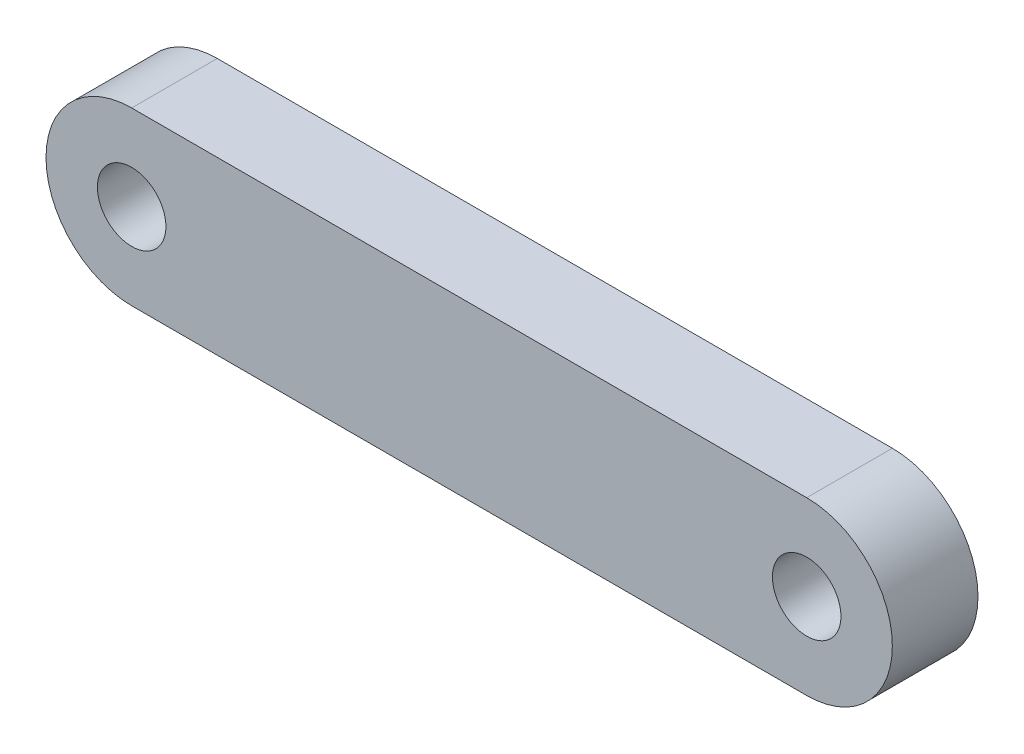
ISO-10303-21;
HEADER;
FILE_DESCRIPTION(('STEP AP214'),'2;1');
FILE_NAME('part.step','',(''),(''),'','','');
FILE_SCHEMA(('AUTOMOTIVE_DESIGN { 1 0 10303 214 1 1 1 1 }'));
ENDSEC;
DATA;
#1=APPLICATION_CONTEXT('core data for automotive mechanical design processes');
#2=APPLICATION_PROTOCOL_DEFINITION('international standard','automotive_design',2000,#1);
#3=PRODUCT_CONTEXT('',#1,'mechanical');
#4=PRODUCT('Part','Part','',(#3));
#5=PRODUCT_RELATED_PRODUCT_CATEGORY('part','',(#4));
#6=PRODUCT_DEFINITION_FORMATION('','',#4);
#7=PRODUCT_DEFINITION_CONTEXT('part definition',#1,'design');
#8=PRODUCT_DEFINITION('design','',#6,#7);
#9=PRODUCT_DEFINITION_SHAPE('','',#8);
#10=(LENGTH_UNIT() NAMED_UNIT(*) SI_UNIT(.MILLI.,.METRE.));
#11=(NAMED_UNIT(*) PLANE_ANGLE_UNIT() SI_UNIT($,.RADIAN.));
#12=(NAMED_UNIT(*) SI_UNIT($,.STERADIAN.) SOLID_ANGLE_UNIT());
#13=UNCERTAINTY_MEASURE_WITH_UNIT(LENGTH_MEASURE(1.E-05),#10,'distance_accuracy_value','');
#14=(GEOMETRIC_REPRESENTATION_CONTEXT(3) GLOBAL_UNCERTAINTY_ASSIGNED_CONTEXT((#13)) GLOBAL_UNIT_ASSIGNED_CONTEXT((#10,
#11,#12)) REPRESENTATION_CONTEXT('',''));
#15=CARTESIAN_POINT('',(0.,0.,0.));
#16=DIRECTION('',(0.,0.,1.));
#17=DIRECTION('',(1.,0.,0.));
#18=AXIS2_PLACEMENT_3D('',#15,#16,#17);
#19=CARTESIAN_POINT('',(-19.7,0.,2.5));
#20=DIRECTION('',(0.,0.,1.));
#21=DIRECTION('',(1.,0.,0.));
#22=AXIS2_PLACEMENT_3D('',#19,#20,#21);
#23=PLANE('',#22);
#24=CARTESIAN_POINT('',(19.7,0.,2.5));
#25=DIRECTION('',(0.,0.,1.));
#26=DIRECTION('',(1.,0.,0.));
#27=AXIS2_PLACEMENT_3D('',#24,#25,#26);
#28=CIRCLE('',#27,2.);
#29=CARTESIAN_POINT('',(21.7,0.,2.5));
#30=VERTEX_POINT('',#29);
#31=EDGE_CURVE('E112',#30,#30,#28,.T.);
#32=ORIENTED_EDGE('',*,*,#31,.F.);
#33=EDGE_LOOP('',(#32));
#34=FACE_BOUND('',#33,.T.);
#35=CARTESIAN_POINT('',(-19.7,0.,2.5));
#36=DIRECTION('',(0.,0.,1.));
#37=DIRECTION('',(1.,0.,0.));
#38=AXIS2_PLACEMENT_3D('',#35,#36,#37);
#39=CIRCLE('',#38,5.);
#40=CARTESIAN_POINT('',(-19.7,5.,2.5));
#41=VERTEX_POINT('',#40);
#42=CARTESIAN_POINT('',(-19.7,-5.,2.5));
#43=VERTEX_POINT('',#42);
#44=EDGE_CURVE('E92',#41,#43,#39,.T.);
#45=ORIENTED_EDGE('',*,*,#44,.T.);
#46=DIRECTION('',(1.,0.,0.));
#47=VECTOR('',#46,1.);
#48=CARTESIAN_POINT('',(-19.7,-5.,2.5));
#49=LINE('',#48,#47);
#50=CARTESIAN_POINT('',(19.7,-4.99999999999999,2.5));
#51=VERTEX_POINT('',#50);
#52=EDGE_CURVE('E87',#43,#51,#49,.T.);
#53=ORIENTED_EDGE('',*,*,#52,.T.);
#54=CARTESIAN_POINT('',(19.7,0.,2.5));
#55=DIRECTION('',(0.,0.,1.));
#56=DIRECTION('',(1.,0.,0.));
#57=AXIS2_PLACEMENT_3D('',#54,#55,#56);
#58=CIRCLE('',#57,5.);
#59=CARTESIAN_POINT('',(19.7,5.00000000000001,2.5));
#60=VERTEX_POINT('',#59);
#61=EDGE_CURVE('E90',#51,#60,#58,.T.);
#62=ORIENTED_EDGE('',*,*,#61,.T.);
#63=DIRECTION('',(-1.,0.,0.));
#64=VECTOR('',#63,1.);
#65=CARTESIAN_POINT('',(-19.7,5.,2.5));
#66=LINE('',#65,#64);
#67=EDGE_CURVE('E57',#60,#41,#66,.T.);
#68=ORIENTED_EDGE('',*,*,#67,.T.);
#69=EDGE_LOOP('',(#45,#53,#62,#68));
#70=FACE_BOUND('',#69,.T.);
#71=CARTESIAN_POINT('',(-19.7,0.,2.5));
#72=DIRECTION('',(0.,0.,1.));
#73=DIRECTION('',(1.,0.,0.));
#74=AXIS2_PLACEMENT_3D('',#71,#72,#73);
#75=CIRCLE('',#74,2.);
#76=CARTESIAN_POINT('',(-17.7,0.,2.5));
#77=VERTEX_POINT('',#76);
#78=EDGE_CURVE('E134',#77,#77,#75,.T.);
#79=ORIENTED_EDGE('',*,*,#78,.F.);
#80=EDGE_LOOP('',(#79));
#81=FACE_BOUND('',#80,.T.);
#82=ADVANCED_FACE('F39',(#34,#70,#81),#23,.T.);
#83=CARTESIAN_POINT('',(-19.7,0.,-2.5));
#84=DIRECTION('',(0.,0.,1.));
#85=DIRECTION('',(1.,0.,0.));
#86=AXIS2_PLACEMENT_3D('',#83,#84,#85);
#87=PLANE('',#86);
#88=CARTESIAN_POINT('',(-19.7,0.,-2.5));
#89=DIRECTION('',(0.,0.,1.));
#90=DIRECTION('',(1.,0.,0.));
#91=AXIS2_PLACEMENT_3D('',#88,#89,#90);
#92=CIRCLE('',#91,5.);
#93=CARTESIAN_POINT('',(-19.7,5.,-2.5));
#94=VERTEX_POINT('',#93);
#95=CARTESIAN_POINT('',(-19.7,-5.,-2.5));
#96=VERTEX_POINT('',#95);
#97=EDGE_CURVE('E108',#94,#96,#92,.T.);
#98=ORIENTED_EDGE('',*,*,#97,.F.);
#99=DIRECTION('',(-1.,0.,0.));
#100=VECTOR('',#99,1.);
#101=CARTESIAN_POINT('',(-19.7,5.,-2.5));
#102=LINE('',#101,#100);
#103=CARTESIAN_POINT('',(19.7,5.00000000000001,-2.5));
#104=VERTEX_POINT('',#103);
#105=EDGE_CURVE('E80',#104,#94,#102,.T.);
#106=ORIENTED_EDGE('',*,*,#105,.F.);
#107=CARTESIAN_POINT('',(19.7,0.,-2.5));
#108=DIRECTION('',(0.,0.,1.));
#109=DIRECTION('',(1.,0.,0.));
#110=AXIS2_PLACEMENT_3D('',#107,#108,#109);
#111=CIRCLE('',#110,5.);
#112=CARTESIAN_POINT('',(19.7,-4.99999999999999,-2.5));
#113=VERTEX_POINT('',#112);
#114=EDGE_CURVE('E74',#113,#104,#111,.T.);
#115=ORIENTED_EDGE('',*,*,#114,.F.);
#116=DIRECTION('',(1.,0.,0.));
#117=VECTOR('',#116,1.);
#118=CARTESIAN_POINT('',(-19.7,-5.,-2.5));
#119=LINE('',#118,#117);
#120=EDGE_CURVE('E97',#96,#113,#119,.T.);
#121=ORIENTED_EDGE('',*,*,#120,.F.);
#122=EDGE_LOOP('',(#98,#106,#115,#121));
#123=FACE_BOUND('',#122,.T.);
#124=CARTESIAN_POINT('',(19.7,0.,-2.5));
#125=DIRECTION('',(0.,0.,1.));
#126=DIRECTION('',(1.,0.,0.));
#127=AXIS2_PLACEMENT_3D('',#124,#125,#126);
#128=CIRCLE('',#127,2.);
#129=CARTESIAN_POINT('',(21.7,0.,-2.5));
#130=VERTEX_POINT('',#129);
#131=EDGE_CURVE('E130',#130,#130,#128,.T.);
#132=ORIENTED_EDGE('',*,*,#131,.T.);
#133=EDGE_LOOP('',(#132));
#134=FACE_BOUND('',#133,.T.);
#135=CARTESIAN_POINT('',(-19.7,0.,-2.5));
#136=DIRECTION('',(0.,0.,1.));
#137=DIRECTION('',(1.,0.,0.));
#138=AXIS2_PLACEMENT_3D('',#135,#136,#137);
#139=CIRCLE('',#138,2.);
#140=CARTESIAN_POINT('',(-17.7,0.,-2.5));
#141=VERTEX_POINT('',#140);
#142=EDGE_CURVE('E138',#141,#141,#139,.T.);
#143=ORIENTED_EDGE('',*,*,#142,.T.);
#144=EDGE_LOOP('',(#143));
#145=FACE_BOUND('',#144,.T.);
#146=ADVANCED_FACE('F125',(#123,#134,#145),#87,.F.);
#147=CARTESIAN_POINT('',(-19.7,0.,2.5));
#148=DIRECTION('',(0.,0.,-1.));
#149=DIRECTION('',(-1.,0.,0.));
#150=AXIS2_PLACEMENT_3D('',#147,#148,#149);
#151=CYLINDRICAL_SURFACE('',#150,5.);
#152=ORIENTED_EDGE('',*,*,#97,.T.);
#153=DIRECTION('',(0.,0.,-1.));
#154=VECTOR('',#153,1.);
#155=CARTESIAN_POINT('',(-19.7,-5.,2.5));
#156=LINE('',#155,#154);
#157=EDGE_CURVE('E11',#43,#96,#156,.T.);
#158=ORIENTED_EDGE('',*,*,#157,.F.);
#159=ORIENTED_EDGE('',*,*,#44,.F.);
#160=DIRECTION('',(0.,0.,-1.));
#161=VECTOR('',#160,1.);
#162=CARTESIAN_POINT('',(-19.7,5.,2.5));
#163=LINE('',#162,#161);
#164=EDGE_CURVE('E104',#41,#94,#163,.T.);
#165=ORIENTED_EDGE('',*,*,#164,.T.);
#166=EDGE_LOOP('',(#152,#158,#159,#165));
#167=FACE_BOUND('',#166,.T.);
#168=ADVANCED_FACE('F41',(#167),#151,.T.);
#169=CARTESIAN_POINT('',(-19.7,-5.,2.5));
#170=DIRECTION('',(0.,1.,0.));
#171=DIRECTION('',(-1.,0.,0.));
#172=AXIS2_PLACEMENT_3D('',#169,#170,#171);
#173=PLANE('',#172);
#174=ORIENTED_EDGE('',*,*,#120,.T.);
#175=DIRECTION('',(0.,0.,-1.));
#176=VECTOR('',#175,1.);
#177=CARTESIAN_POINT('',(19.7,-4.99999999999999,2.5));
#178=LINE('',#177,#176);
#179=EDGE_CURVE('E49',#51,#113,#178,.T.);
#180=ORIENTED_EDGE('',*,*,#179,.F.);
#181=ORIENTED_EDGE('',*,*,#52,.F.);
#182=ORIENTED_EDGE('',*,*,#157,.T.);
#183=EDGE_LOOP('',(#174,#180,#181,#182));
#184=FACE_BOUND('',#183,.T.);
#185=ADVANCED_FACE('F96',(#184),#173,.F.);
#186=CARTESIAN_POINT('',(19.7,0.,2.5));
#187=DIRECTION('',(0.,0.,-1.));
#188=DIRECTION('',(-1.,0.,0.));
#189=AXIS2_PLACEMENT_3D('',#186,#187,#188);
#190=CYLINDRICAL_SURFACE('',#189,5.);
#191=ORIENTED_EDGE('',*,*,#114,.T.);
#192=DIRECTION('',(0.,0.,-1.));
#193=VECTOR('',#192,1.);
#194=CARTESIAN_POINT('',(19.7,5.00000000000001,2.5));
#195=LINE('',#194,#193);
#196=EDGE_CURVE('E99',#60,#104,#195,.T.);
#197=ORIENTED_EDGE('',*,*,#196,.F.);
#198=ORIENTED_EDGE('',*,*,#61,.F.);
#199=ORIENTED_EDGE('',*,*,#179,.T.);
#200=EDGE_LOOP('',(#191,#197,#198,#199));
#201=FACE_BOUND('',#200,.T.);
#202=ADVANCED_FACE('F100',(#201),#190,.T.);
#203=CARTESIAN_POINT('',(-19.7,5.,2.5));
#204=DIRECTION('',(0.,-1.,0.));
#205=DIRECTION('',(1.,0.,0.));
#206=AXIS2_PLACEMENT_3D('',#203,#204,#205);
#207=PLANE('',#206);
#208=ORIENTED_EDGE('',*,*,#105,.T.);
#209=ORIENTED_EDGE('',*,*,#164,.F.);
#210=ORIENTED_EDGE('',*,*,#67,.F.);
#211=ORIENTED_EDGE('',*,*,#196,.T.);
#212=EDGE_LOOP('',(#208,#209,#210,#211));
#213=FACE_BOUND('',#212,.T.);
#214=ADVANCED_FACE('F122',(#213),#207,.F.);
#215=CARTESIAN_POINT('',(19.7,0.,2.5));
#216=DIRECTION('',(0.,0.,-1.));
#217=DIRECTION('',(-1.,0.,0.));
#218=AXIS2_PLACEMENT_3D('',#215,#216,#217);
#219=CYLINDRICAL_SURFACE('',#218,2.);
#220=ORIENTED_EDGE('',*,*,#31,.T.);
#221=EDGE_LOOP('',(#220));
#222=FACE_BOUND('',#221,.T.);
#223=ORIENTED_EDGE('',*,*,#131,.F.);
#224=EDGE_LOOP('',(#223));
#225=FACE_BOUND('',#224,.T.);
#226=ADVANCED_FACE('F157',(#222,#225),#219,.F.);
#227=CARTESIAN_POINT('',(-19.7,0.,2.5));
#228=DIRECTION('',(0.,0.,-1.));
#229=DIRECTION('',(-1.,0.,0.));
#230=AXIS2_PLACEMENT_3D('',#227,#228,#229);
#231=CYLINDRICAL_SURFACE('',#230,2.);
#232=ORIENTED_EDGE('',*,*,#78,.T.);
#233=EDGE_LOOP('',(#232));
#234=FACE_BOUND('',#233,.T.);
#235=ORIENTED_EDGE('',*,*,#142,.F.);
#236=EDGE_LOOP('',(#235));
#237=FACE_BOUND('',#236,.T.);
#238=ADVANCED_FACE('F146',(#234,#237),#231,.F.);
#239=CLOSED_SHELL('',(#82,#146,#168,#185,#202,#214,#226,#238));
#240=MANIFOLD_SOLID_BREP('B2',#239);
#241=ADVANCED_BREP_SHAPE_REPRESENTATION('',(#18,#240),#14);
#242=SHAPE_DEFINITION_REPRESENTATION(#9,#241);
ENDSEC;
END-ISO-10303-21;
